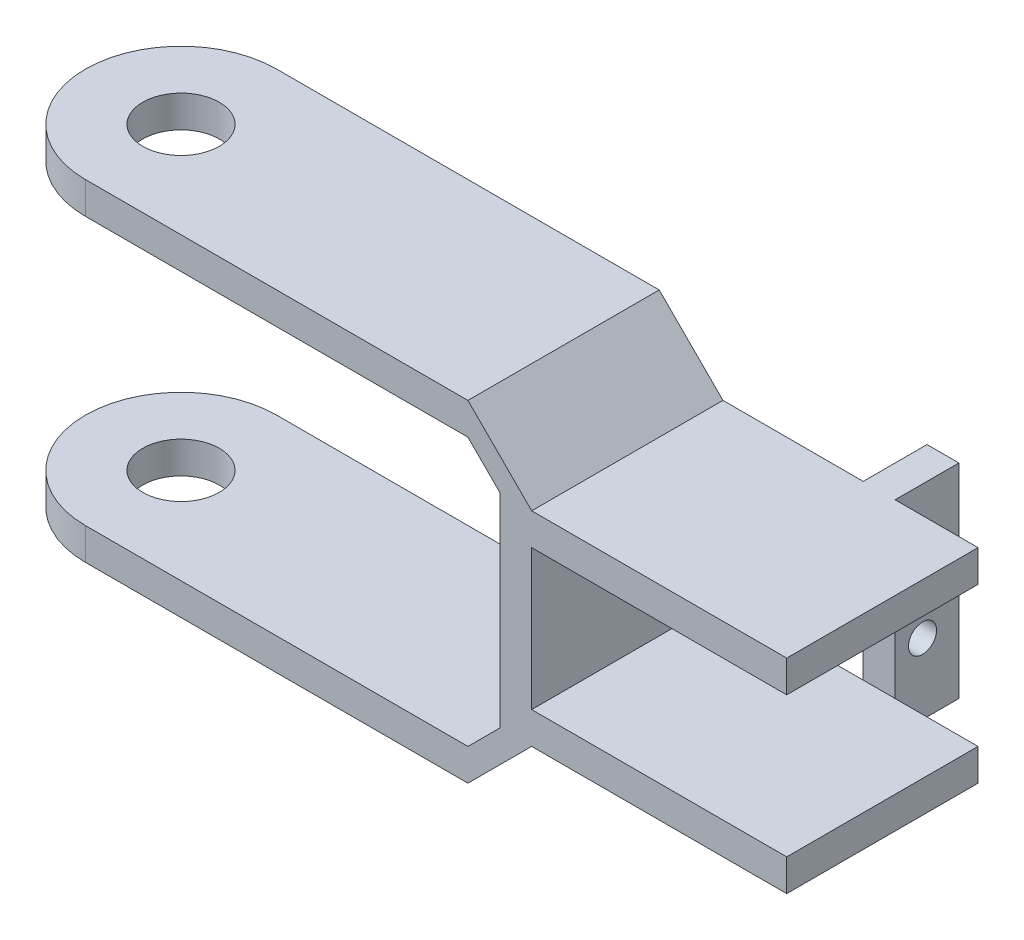
ISO-10303-21;
HEADER;
FILE_DESCRIPTION(('STEP AP214'),'2;1');
FILE_NAME('part.step','',(''),(''),'','','');
FILE_SCHEMA(('AUTOMOTIVE_DESIGN { 1 0 10303 214 1 1 1 1 }'));
ENDSEC;
DATA;
#1=APPLICATION_CONTEXT('core data for automotive mechanical design processes');
#2=APPLICATION_PROTOCOL_DEFINITION('international standard','automotive_design',2000,#1);
#3=PRODUCT_CONTEXT('',#1,'mechanical');
#4=PRODUCT('Part','Part','',(#3));
#5=PRODUCT_RELATED_PRODUCT_CATEGORY('part','',(#4));
#6=PRODUCT_DEFINITION_FORMATION('','',#4);
#7=PRODUCT_DEFINITION_CONTEXT('part definition',#1,'design');
#8=PRODUCT_DEFINITION('design','',#6,#7);
#9=PRODUCT_DEFINITION_SHAPE('','',#8);
#10=(LENGTH_UNIT() NAMED_UNIT(*) SI_UNIT(.MILLI.,.METRE.));
#11=(NAMED_UNIT(*) PLANE_ANGLE_UNIT() SI_UNIT($,.RADIAN.));
#12=(NAMED_UNIT(*) SI_UNIT($,.STERADIAN.) SOLID_ANGLE_UNIT());
#13=UNCERTAINTY_MEASURE_WITH_UNIT(LENGTH_MEASURE(1.E-05),#10,'distance_accuracy_value','');
#14=(GEOMETRIC_REPRESENTATION_CONTEXT(3) GLOBAL_UNCERTAINTY_ASSIGNED_CONTEXT((#13)) GLOBAL_UNIT_ASSIGNED_CONTEXT((#10,
#11,#12)) REPRESENTATION_CONTEXT('',''));
#15=CARTESIAN_POINT('',(0.,0.,0.));
#16=DIRECTION('',(0.,0.,1.));
#17=DIRECTION('',(1.,0.,0.));
#18=AXIS2_PLACEMENT_3D('',#15,#16,#17);
#19=CARTESIAN_POINT('',(0.,5.,-15.));
#20=DIRECTION('',(0.,0.,1.));
#21=DIRECTION('',(1.,0.,0.));
#22=AXIS2_PLACEMENT_3D('',#19,#20,#21);
#23=PLANE('',#22);
#24=DIRECTION('',(0.,-1.,0.));
#25=VECTOR('',#24,1.);
#26=CARTESIAN_POINT('',(97.,-10.,-15.));
#27=LINE('',#26,#25);
#28=CARTESIAN_POINT('',(97.,-5.,-15.));
#29=VERTEX_POINT('',#28);
#30=CARTESIAN_POINT('',(97.,-10.,-15.));
#31=VERTEX_POINT('',#30);
#32=EDGE_CURVE('E50',#29,#31,#27,.T.);
#33=ORIENTED_EDGE('',*,*,#32,.F.);
#34=DIRECTION('',(-1.,0.,0.));
#35=VECTOR('',#34,1.);
#36=CARTESIAN_POINT('',(110.,-5.,-15.));
#37=LINE('',#36,#35);
#38=CARTESIAN_POINT('',(110.,-5.,-15.));
#39=VERTEX_POINT('',#38);
#40=EDGE_CURVE('E340',#39,#29,#37,.T.);
#41=ORIENTED_EDGE('',*,*,#40,.F.);
#42=DIRECTION('',(0.,1.,0.));
#43=VECTOR('',#42,1.);
#44=CARTESIAN_POINT('',(110.,-10.,-15.));
#45=LINE('',#44,#43);
#46=CARTESIAN_POINT('',(110.,-10.,-15.));
#47=VERTEX_POINT('',#46);
#48=EDGE_CURVE('E336',#47,#39,#45,.T.);
#49=ORIENTED_EDGE('',*,*,#48,.F.);
#50=DIRECTION('',(1.,0.,0.));
#51=VECTOR('',#50,1.);
#52=CARTESIAN_POINT('',(70.,-10.,-15.));
#53=LINE('',#52,#51);
#54=EDGE_CURVE('E331',#31,#47,#53,.T.);
#55=ORIENTED_EDGE('',*,*,#54,.F.);
#56=EDGE_LOOP('',(#33,#41,#49,#55));
#57=FACE_BOUND('',#56,.T.);
#58=ADVANCED_FACE('F35',(#57),#23,.F.);
#59=CARTESIAN_POINT('',(97.,-32.,-15.));
#60=VERTEX_POINT('',#59);
#61=CARTESIAN_POINT('',(97.,-37.,-15.));
#62=VERTEX_POINT('',#61);
#63=EDGE_CURVE('E58',#60,#62,#27,.T.);
#64=ORIENTED_EDGE('',*,*,#63,.F.);
#65=DIRECTION('',(1.,0.,0.));
#66=VECTOR('',#65,1.);
#67=CARTESIAN_POINT('',(70.,-32.,-15.));
#68=LINE('',#67,#66);
#69=CARTESIAN_POINT('',(110.,-32.,-15.));
#70=VERTEX_POINT('',#69);
#71=EDGE_CURVE('E266',#60,#70,#68,.T.);
#72=ORIENTED_EDGE('',*,*,#71,.T.);
#73=DIRECTION('',(0.,-1.,0.));
#74=VECTOR('',#73,1.);
#75=CARTESIAN_POINT('',(110.,-32.,-15.));
#76=LINE('',#75,#74);
#77=CARTESIAN_POINT('',(110.,-37.,-15.));
#78=VERTEX_POINT('',#77);
#79=EDGE_CURVE('E286',#70,#78,#76,.T.);
#80=ORIENTED_EDGE('',*,*,#79,.T.);
#81=DIRECTION('',(-1.,0.,0.));
#82=VECTOR('',#81,1.);
#83=CARTESIAN_POINT('',(110.,-37.,-15.));
#84=LINE('',#83,#82);
#85=EDGE_CURVE('E290',#78,#62,#84,.T.);
#86=ORIENTED_EDGE('',*,*,#85,.T.);
#87=EDGE_LOOP('',(#64,#72,#80,#86));
#88=FACE_BOUND('',#87,.T.);
#89=ADVANCED_FACE('F488',(#88),#23,.F.);
#90=DIRECTION('',(0.,1.,0.));
#91=VECTOR('',#90,1.);
#92=CARTESIAN_POINT('',(92.,-37.,-15.));
#93=LINE('',#92,#91);
#94=CARTESIAN_POINT('',(92.,-37.,-15.));
#95=VERTEX_POINT('',#94);
#96=CARTESIAN_POINT('',(92.,-32.,-15.));
#97=VERTEX_POINT('',#96);
#98=EDGE_CURVE('E205',#95,#97,#93,.T.);
#99=ORIENTED_EDGE('',*,*,#98,.F.);
#100=CARTESIAN_POINT('',(70.,-37.,-15.));
#101=VERTEX_POINT('',#100);
#102=EDGE_CURVE('E289',#95,#101,#84,.T.);
#103=ORIENTED_EDGE('',*,*,#102,.T.);
#104=DIRECTION('',(-0.707106781186547,-0.707106781186548,0.));
#105=VECTOR('',#104,1.);
#106=CARTESIAN_POINT('',(70.,-37.,-15.));
#107=LINE('',#106,#105);
#108=CARTESIAN_POINT('',(60.,-47.,-15.));
#109=VERTEX_POINT('',#108);
#110=EDGE_CURVE('E292',#101,#109,#107,.T.);
#111=ORIENTED_EDGE('',*,*,#110,.T.);
#112=DIRECTION('',(1.,0.,0.));
#113=VECTOR('',#112,1.);
#114=CARTESIAN_POINT('',(0.,-47.,-15.));
#115=LINE('',#114,#113);
#116=CARTESIAN_POINT('',(0.,-47.,-15.));
#117=VERTEX_POINT('',#116);
#118=EDGE_CURVE('E250',#117,#109,#115,.T.);
#119=ORIENTED_EDGE('',*,*,#118,.F.);
#120=DIRECTION('',(0.,1.,0.));
#121=VECTOR('',#120,1.);
#122=CARTESIAN_POINT('',(0.,-47.,-15.));
#123=LINE('',#122,#121);
#124=CARTESIAN_POINT('',(0.,-42.,-15.));
#125=VERTEX_POINT('',#124);
#126=EDGE_CURVE('E263',#117,#125,#123,.T.);
#127=ORIENTED_EDGE('',*,*,#126,.T.);
#128=DIRECTION('',(1.,0.,0.));
#129=VECTOR('',#128,1.);
#130=CARTESIAN_POINT('',(0.,-42.,-15.));
#131=LINE('',#130,#129);
#132=CARTESIAN_POINT('',(60.,-42.,-15.));
#133=VERTEX_POINT('',#132);
#134=EDGE_CURVE('E258',#125,#133,#131,.T.);
#135=ORIENTED_EDGE('',*,*,#134,.T.);
#136=DIRECTION('',(0.707106781186546,0.707106781186548,0.));
#137=VECTOR('',#136,1.);
#138=CARTESIAN_POINT('',(70.,-32.,-15.));
#139=LINE('',#138,#137);
#140=CARTESIAN_POINT('',(65.,-37.,-15.));
#141=VERTEX_POINT('',#140);
#142=EDGE_CURVE('E271',#133,#141,#139,.T.);
#143=ORIENTED_EDGE('',*,*,#142,.T.);
#144=DIRECTION('',(0.,-1.,0.));
#145=VECTOR('',#144,1.);
#146=CARTESIAN_POINT('',(65.,-21.,-15.));
#147=LINE('',#146,#145);
#148=CARTESIAN_POINT('',(65.,-5.,-15.));
#149=VERTEX_POINT('',#148);
#150=EDGE_CURVE('E315',#149,#141,#147,.T.);
#151=ORIENTED_EDGE('',*,*,#150,.F.);
#152=DIRECTION('',(0.707106781186547,-0.707106781186548,0.));
#153=VECTOR('',#152,1.);
#154=CARTESIAN_POINT('',(60.,0.,-15.));
#155=LINE('',#154,#153);
#156=CARTESIAN_POINT('',(60.,0.,-15.));
#157=VERTEX_POINT('',#156);
#158=EDGE_CURVE('E328',#157,#149,#155,.T.);
#159=ORIENTED_EDGE('',*,*,#158,.F.);
#160=DIRECTION('',(-1.,0.,0.));
#161=VECTOR('',#160,1.);
#162=CARTESIAN_POINT('',(0.,0.,-15.));
#163=LINE('',#162,#161);
#164=CARTESIAN_POINT('',(0.,0.,-15.));
#165=VERTEX_POINT('',#164);
#166=EDGE_CURVE('E379',#157,#165,#163,.T.);
#167=ORIENTED_EDGE('',*,*,#166,.T.);
#168=DIRECTION('',(0.,-1.,0.));
#169=VECTOR('',#168,1.);
#170=CARTESIAN_POINT('',(0.,5.,-15.));
#171=LINE('',#170,#169);
#172=CARTESIAN_POINT('',(0.,5.,-15.));
#173=VERTEX_POINT('',#172);
#174=EDGE_CURVE('E43',#173,#165,#171,.T.);
#175=ORIENTED_EDGE('',*,*,#174,.F.);
#176=DIRECTION('',(-1.,0.,0.));
#177=VECTOR('',#176,1.);
#178=CARTESIAN_POINT('',(0.,5.,-15.));
#179=LINE('',#178,#177);
#180=CARTESIAN_POINT('',(60.,5.,-15.));
#181=VERTEX_POINT('',#180);
#182=EDGE_CURVE('E383',#181,#173,#179,.T.);
#183=ORIENTED_EDGE('',*,*,#182,.F.);
#184=DIRECTION('',(-0.707106781186547,0.707106781186548,0.));
#185=VECTOR('',#184,1.);
#186=CARTESIAN_POINT('',(70.,-5.,-15.));
#187=LINE('',#186,#185);
#188=CARTESIAN_POINT('',(70.,-5.,-15.));
#189=VERTEX_POINT('',#188);
#190=EDGE_CURVE('E343',#189,#181,#187,.T.);
#191=ORIENTED_EDGE('',*,*,#190,.F.);
#192=CARTESIAN_POINT('',(92.,-5.,-15.));
#193=VERTEX_POINT('',#192);
#194=EDGE_CURVE('E339',#193,#189,#37,.T.);
#195=ORIENTED_EDGE('',*,*,#194,.F.);
#196=CARTESIAN_POINT('',(92.,-10.,-15.));
#197=VERTEX_POINT('',#196);
#198=EDGE_CURVE('E226',#197,#193,#93,.T.);
#199=ORIENTED_EDGE('',*,*,#198,.F.);
#200=CARTESIAN_POINT('',(70.,-10.,-15.));
#201=VERTEX_POINT('',#200);
#202=EDGE_CURVE('E333',#201,#197,#53,.T.);
#203=ORIENTED_EDGE('',*,*,#202,.F.);
#204=DIRECTION('',(0.,1.,0.));
#205=VECTOR('',#204,1.);
#206=CARTESIAN_POINT('',(70.,-10.,-15.));
#207=LINE('',#206,#205);
#208=CARTESIAN_POINT('',(70.,-32.,-15.));
#209=VERTEX_POINT('',#208);
#210=EDGE_CURVE('E318',#209,#201,#207,.T.);
#211=ORIENTED_EDGE('',*,*,#210,.F.);
#212=EDGE_CURVE('E283',#209,#97,#68,.T.);
#213=ORIENTED_EDGE('',*,*,#212,.T.);
#214=EDGE_LOOP('',(#99,#103,#111,#119,#127,#135,#143,#151,#159,#167,#175,#183,#191,#195,#199,
#203,#211,#213));
#215=FACE_BOUND('',#214,.T.);
#216=ADVANCED_FACE('F414',(#215),#23,.F.);
#217=CARTESIAN_POINT('',(0.,5.,0.));
#218=DIRECTION('',(0.,1.,0.));
#219=DIRECTION('',(0.,0.,1.));
#220=AXIS2_PLACEMENT_3D('',#217,#218,#219);
#221=PLANE('',#220);
#222=CARTESIAN_POINT('',(0.,5.,0.));
#223=DIRECTION('',(0.,1.,0.));
#224=DIRECTION('',(0.,0.,1.));
#225=AXIS2_PLACEMENT_3D('',#222,#223,#224);
#226=CIRCLE('',#225,15.);
#227=CARTESIAN_POINT('',(0.,5.,15.));
#228=VERTEX_POINT('',#227);
#229=EDGE_CURVE('E375',#173,#228,#226,.T.);
#230=ORIENTED_EDGE('',*,*,#229,.T.);
#231=DIRECTION('',(1.,0.,0.));
#232=VECTOR('',#231,1.);
#233=CARTESIAN_POINT('',(0.,5.,15.));
#234=LINE('',#233,#232);
#235=CARTESIAN_POINT('',(60.,5.,15.));
#236=VERTEX_POINT('',#235);
#237=EDGE_CURVE('E378',#228,#236,#234,.T.);
#238=ORIENTED_EDGE('',*,*,#237,.T.);
#239=DIRECTION('',(0.,0.,-1.));
#240=VECTOR('',#239,1.);
#241=CARTESIAN_POINT('',(60.,5.,15.));
#242=LINE('',#241,#240);
#243=EDGE_CURVE('E381',#236,#181,#242,.T.);
#244=ORIENTED_EDGE('',*,*,#243,.T.);
#245=ORIENTED_EDGE('',*,*,#182,.T.);
#246=EDGE_LOOP('',(#230,#238,#244,#245));
#247=FACE_BOUND('',#246,.T.);
#248=CARTESIAN_POINT('',(0.,5.,0.));
#249=DIRECTION('',(0.,1.,0.));
#250=DIRECTION('',(0.,0.,1.));
#251=AXIS2_PLACEMENT_3D('',#248,#249,#250);
#252=CIRCLE('',#251,6.);
#253=CARTESIAN_POINT('',(0.,5.,6.));
#254=VERTEX_POINT('',#253);
#255=EDGE_CURVE('E369',#254,#254,#252,.T.);
#256=ORIENTED_EDGE('',*,*,#255,.F.);
#257=EDGE_LOOP('',(#256));
#258=FACE_BOUND('',#257,.T.);
#259=ADVANCED_FACE('F410',(#247,#258),#221,.T.);
#260=CARTESIAN_POINT('',(0.,0.,0.));
#261=DIRECTION('',(0.,1.,0.));
#262=DIRECTION('',(0.,0.,1.));
#263=AXIS2_PLACEMENT_3D('',#260,#261,#262);
#264=PLANE('',#263);
#265=CARTESIAN_POINT('',(0.,0.,0.));
#266=DIRECTION('',(0.,1.,0.));
#267=DIRECTION('',(0.,0.,1.));
#268=AXIS2_PLACEMENT_3D('',#265,#266,#267);
#269=CIRCLE('',#268,15.);
#270=CARTESIAN_POINT('',(0.,0.,15.));
#271=VERTEX_POINT('',#270);
#272=EDGE_CURVE('E372',#165,#271,#269,.T.);
#273=ORIENTED_EDGE('',*,*,#272,.F.);
#274=ORIENTED_EDGE('',*,*,#166,.F.);
#275=DIRECTION('',(0.,0.,-1.));
#276=VECTOR('',#275,1.);
#277=CARTESIAN_POINT('',(60.,0.,15.));
#278=LINE('',#277,#276);
#279=CARTESIAN_POINT('',(60.,0.,15.));
#280=VERTEX_POINT('',#279);
#281=EDGE_CURVE('E390',#280,#157,#278,.T.);
#282=ORIENTED_EDGE('',*,*,#281,.F.);
#283=DIRECTION('',(1.,0.,0.));
#284=VECTOR('',#283,1.);
#285=CARTESIAN_POINT('',(0.,0.,15.));
#286=LINE('',#285,#284);
#287=EDGE_CURVE('E387',#271,#280,#286,.T.);
#288=ORIENTED_EDGE('',*,*,#287,.F.);
#289=EDGE_LOOP('',(#273,#274,#282,#288));
#290=FACE_BOUND('',#289,.T.);
#291=CARTESIAN_POINT('',(0.,0.,0.));
#292=DIRECTION('',(0.,1.,0.));
#293=DIRECTION('',(0.,0.,1.));
#294=AXIS2_PLACEMENT_3D('',#291,#292,#293);
#295=CIRCLE('',#294,6.);
#296=CARTESIAN_POINT('',(0.,0.,6.));
#297=VERTEX_POINT('',#296);
#298=EDGE_CURVE('E362',#297,#297,#295,.T.);
#299=ORIENTED_EDGE('',*,*,#298,.T.);
#300=EDGE_LOOP('',(#299));
#301=FACE_BOUND('',#300,.T.);
#302=ADVANCED_FACE('F402',(#290,#301),#264,.F.);
#303=CARTESIAN_POINT('',(0.,5.,0.));
#304=DIRECTION('',(0.,-1.,0.));
#305=DIRECTION('',(0.,0.,-1.));
#306=AXIS2_PLACEMENT_3D('',#303,#304,#305);
#307=CYLINDRICAL_SURFACE('',#306,15.);
#308=ORIENTED_EDGE('',*,*,#272,.T.);
#309=DIRECTION('',(0.,-1.,0.));
#310=VECTOR('',#309,1.);
#311=CARTESIAN_POINT('',(0.,5.,15.));
#312=LINE('',#311,#310);
#313=EDGE_CURVE('E11',#228,#271,#312,.T.);
#314=ORIENTED_EDGE('',*,*,#313,.F.);
#315=ORIENTED_EDGE('',*,*,#229,.F.);
#316=ORIENTED_EDGE('',*,*,#174,.T.);
#317=EDGE_LOOP('',(#308,#314,#315,#316));
#318=FACE_BOUND('',#317,.T.);
#319=ADVANCED_FACE('F37',(#318),#307,.T.);
#320=CARTESIAN_POINT('',(0.,5.,15.));
#321=DIRECTION('',(0.,0.,-1.));
#322=DIRECTION('',(-1.,0.,0.));
#323=AXIS2_PLACEMENT_3D('',#320,#321,#322);
#324=PLANE('',#323);
#325=ORIENTED_EDGE('',*,*,#287,.T.);
#326=DIRECTION('',(0.707106781186547,-0.707106781186548,0.));
#327=VECTOR('',#326,1.);
#328=CARTESIAN_POINT('',(60.,0.,15.));
#329=LINE('',#328,#327);
#330=CARTESIAN_POINT('',(65.,-5.,15.));
#331=VERTEX_POINT('',#330);
#332=EDGE_CURVE('E327',#280,#331,#329,.T.);
#333=ORIENTED_EDGE('',*,*,#332,.T.);
#334=DIRECTION('',(0.,-1.,0.));
#335=VECTOR('',#334,1.);
#336=CARTESIAN_POINT('',(65.,-21.,15.));
#337=LINE('',#336,#335);
#338=CARTESIAN_POINT('',(65.,-37.,15.));
#339=VERTEX_POINT('',#338);
#340=EDGE_CURVE('E313',#331,#339,#337,.T.);
#341=ORIENTED_EDGE('',*,*,#340,.T.);
#342=DIRECTION('',(0.707106781186548,0.707106781186547,0.));
#343=VECTOR('',#342,1.);
#344=CARTESIAN_POINT('',(60.,-42.,15.));
#345=LINE('',#344,#343);
#346=CARTESIAN_POINT('',(60.,-42.,15.));
#347=VERTEX_POINT('',#346);
#348=EDGE_CURVE('E280',#347,#339,#345,.T.);
#349=ORIENTED_EDGE('',*,*,#348,.F.);
#350=DIRECTION('',(-1.,0.,0.));
#351=VECTOR('',#350,1.);
#352=CARTESIAN_POINT('',(60.,-42.,15.));
#353=LINE('',#352,#351);
#354=CARTESIAN_POINT('',(0.,-42.,15.));
#355=VERTEX_POINT('',#354);
#356=EDGE_CURVE('E251',#347,#355,#353,.T.);
#357=ORIENTED_EDGE('',*,*,#356,.T.);
#358=DIRECTION('',(0.,1.,0.));
#359=VECTOR('',#358,1.);
#360=CARTESIAN_POINT('',(0.,-47.,15.));
#361=LINE('',#360,#359);
#362=CARTESIAN_POINT('',(0.,-47.,15.));
#363=VERTEX_POINT('',#362);
#364=EDGE_CURVE('E255',#363,#355,#361,.T.);
#365=ORIENTED_EDGE('',*,*,#364,.F.);
#366=DIRECTION('',(-1.,0.,0.));
#367=VECTOR('',#366,1.);
#368=CARTESIAN_POINT('',(60.,-47.,15.));
#369=LINE('',#368,#367);
#370=CARTESIAN_POINT('',(60.,-47.,15.));
#371=VERTEX_POINT('',#370);
#372=EDGE_CURVE('E253',#371,#363,#369,.T.);
#373=ORIENTED_EDGE('',*,*,#372,.F.);
#374=DIRECTION('',(-0.707106781186547,-0.707106781186548,0.));
#375=VECTOR('',#374,1.);
#376=CARTESIAN_POINT('',(70.,-37.,15.));
#377=LINE('',#376,#375);
#378=CARTESIAN_POINT('',(70.,-37.,15.));
#379=VERTEX_POINT('',#378);
#380=EDGE_CURVE('E277',#379,#371,#377,.T.);
#381=ORIENTED_EDGE('',*,*,#380,.F.);
#382=DIRECTION('',(-1.,0.,0.));
#383=VECTOR('',#382,1.);
#384=CARTESIAN_POINT('',(110.,-37.,15.));
#385=LINE('',#384,#383);
#386=CARTESIAN_POINT('',(110.,-37.,15.));
#387=VERTEX_POINT('',#386);
#388=EDGE_CURVE('E274',#387,#379,#385,.T.);
#389=ORIENTED_EDGE('',*,*,#388,.F.);
#390=DIRECTION('',(0.,-1.,0.));
#391=VECTOR('',#390,1.);
#392=CARTESIAN_POINT('',(110.,-32.,15.));
#393=LINE('',#392,#391);
#394=CARTESIAN_POINT('',(110.,-32.,15.));
#395=VERTEX_POINT('',#394);
#396=EDGE_CURVE('E270',#395,#387,#393,.T.);
#397=ORIENTED_EDGE('',*,*,#396,.F.);
#398=DIRECTION('',(1.,0.,0.));
#399=VECTOR('',#398,1.);
#400=CARTESIAN_POINT('',(70.,-32.,15.));
#401=LINE('',#400,#399);
#402=CARTESIAN_POINT('',(70.,-32.,15.));
#403=VERTEX_POINT('',#402);
#404=EDGE_CURVE('E267',#403,#395,#401,.T.);
#405=ORIENTED_EDGE('',*,*,#404,.F.);
#406=DIRECTION('',(0.,1.,0.));
#407=VECTOR('',#406,1.);
#408=CARTESIAN_POINT('',(70.,-10.,15.));
#409=LINE('',#408,#407);
#410=CARTESIAN_POINT('',(70.,-10.,15.));
#411=VERTEX_POINT('',#410);
#412=EDGE_CURVE('E319',#403,#411,#409,.T.);
#413=ORIENTED_EDGE('',*,*,#412,.T.);
#414=DIRECTION('',(1.,0.,0.));
#415=VECTOR('',#414,1.);
#416=CARTESIAN_POINT('',(70.,-10.,15.));
#417=LINE('',#416,#415);
#418=CARTESIAN_POINT('',(110.,-10.,15.));
#419=VERTEX_POINT('',#418);
#420=EDGE_CURVE('E349',#411,#419,#417,.T.);
#421=ORIENTED_EDGE('',*,*,#420,.T.);
#422=DIRECTION('',(0.,1.,0.));
#423=VECTOR('',#422,1.);
#424=CARTESIAN_POINT('',(110.,-10.,15.));
#425=LINE('',#424,#423);
#426=CARTESIAN_POINT('',(110.,-5.,15.));
#427=VERTEX_POINT('',#426);
#428=EDGE_CURVE('E352',#419,#427,#425,.T.);
#429=ORIENTED_EDGE('',*,*,#428,.T.);
#430=DIRECTION('',(-1.,0.,0.));
#431=VECTOR('',#430,1.);
#432=CARTESIAN_POINT('',(110.,-5.,15.));
#433=LINE('',#432,#431);
#434=CARTESIAN_POINT('',(70.,-5.,15.));
#435=VERTEX_POINT('',#434);
#436=EDGE_CURVE('E355',#427,#435,#433,.T.);
#437=ORIENTED_EDGE('',*,*,#436,.T.);
#438=DIRECTION('',(-0.707106781186547,0.707106781186548,0.));
#439=VECTOR('',#438,1.);
#440=CARTESIAN_POINT('',(70.,-5.,15.));
#441=LINE('',#440,#439);
#442=EDGE_CURVE('E332',#435,#236,#441,.T.);
#443=ORIENTED_EDGE('',*,*,#442,.T.);
#444=ORIENTED_EDGE('',*,*,#237,.F.);
#445=ORIENTED_EDGE('',*,*,#313,.T.);
#446=EDGE_LOOP('',(#325,#333,#341,#349,#357,#365,#373,#381,#389,#397,#405,#413,#421,#429,#437,
#443,#444,#445));
#447=FACE_BOUND('',#446,.T.);
#448=ADVANCED_FACE('F406',(#447),#324,.F.);
#449=CARTESIAN_POINT('',(0.,5.,0.));
#450=DIRECTION('',(0.,-1.,0.));
#451=DIRECTION('',(0.,0.,-1.));
#452=AXIS2_PLACEMENT_3D('',#449,#450,#451);
#453=CYLINDRICAL_SURFACE('',#452,6.);
#454=ORIENTED_EDGE('',*,*,#255,.T.);
#455=EDGE_LOOP('',(#454));
#456=FACE_BOUND('',#455,.T.);
#457=ORIENTED_EDGE('',*,*,#298,.F.);
#458=EDGE_LOOP('',(#457));
#459=FACE_BOUND('',#458,.T.);
#460=ADVANCED_FACE('F503',(#456,#459),#453,.F.);
#461=CARTESIAN_POINT('',(70.,-5.,-15.));
#462=DIRECTION('',(0.707106781186548,0.707106781186547,0.));
#463=DIRECTION('',(-0.707106781186547,0.707106781186548,0.));
#464=AXIS2_PLACEMENT_3D('',#461,#462,#463);
#465=PLANE('',#464);
#466=ORIENTED_EDGE('',*,*,#442,.F.);
#467=DIRECTION('',(0.,0.,1.));
#468=VECTOR('',#467,1.);
#469=CARTESIAN_POINT('',(70.,-5.,-15.));
#470=LINE('',#469,#468);
#471=EDGE_CURVE('E360',#189,#435,#470,.T.);
#472=ORIENTED_EDGE('',*,*,#471,.F.);
#473=ORIENTED_EDGE('',*,*,#190,.T.);
#474=ORIENTED_EDGE('',*,*,#243,.F.);
#475=EDGE_LOOP('',(#466,#472,#473,#474));
#476=FACE_BOUND('',#475,.T.);
#477=ADVANCED_FACE('F418',(#476),#465,.T.);
#478=CARTESIAN_POINT('',(110.,-5.,-15.));
#479=DIRECTION('',(0.,1.,0.));
#480=DIRECTION('',(0.,0.,1.));
#481=AXIS2_PLACEMENT_3D('',#478,#479,#480);
#482=PLANE('',#481);
#483=ORIENTED_EDGE('',*,*,#436,.F.);
#484=DIRECTION('',(0.,0.,1.));
#485=VECTOR('',#484,1.);
#486=CARTESIAN_POINT('',(110.,-5.,-15.));
#487=LINE('',#486,#485);
#488=EDGE_CURVE('E363',#39,#427,#487,.T.);
#489=ORIENTED_EDGE('',*,*,#488,.F.);
#490=ORIENTED_EDGE('',*,*,#40,.T.);
#491=DIRECTION('',(0.,0.,1.));
#492=VECTOR('',#491,1.);
#493=CARTESIAN_POINT('',(97.,-5.,-25.));
#494=LINE('',#493,#492);
#495=CARTESIAN_POINT('',(97.,-5.,-25.));
#496=VERTEX_POINT('',#495);
#497=EDGE_CURVE('E224',#496,#29,#494,.T.);
#498=ORIENTED_EDGE('',*,*,#497,.F.);
#499=DIRECTION('',(1.,0.,0.));
#500=VECTOR('',#499,1.);
#501=CARTESIAN_POINT('',(92.,-5.,-25.));
#502=LINE('',#501,#500);
#503=CARTESIAN_POINT('',(92.,-5.,-25.));
#504=VERTEX_POINT('',#503);
#505=EDGE_CURVE('E203',#504,#496,#502,.T.);
#506=ORIENTED_EDGE('',*,*,#505,.F.);
#507=DIRECTION('',(0.,0.,1.));
#508=VECTOR('',#507,1.);
#509=CARTESIAN_POINT('',(92.,-5.,-25.));
#510=LINE('',#509,#508);
#511=EDGE_CURVE('E232',#504,#193,#510,.T.);
#512=ORIENTED_EDGE('',*,*,#511,.T.);
#513=ORIENTED_EDGE('',*,*,#194,.T.);
#514=ORIENTED_EDGE('',*,*,#471,.T.);
#515=EDGE_LOOP('',(#483,#489,#490,#498,#506,#512,#513,#514));
#516=FACE_BOUND('',#515,.T.);
#517=ADVANCED_FACE('F421',(#516),#482,.T.);
#518=CARTESIAN_POINT('',(110.,-10.,-15.));
#519=DIRECTION('',(1.,0.,0.));
#520=DIRECTION('',(0.,0.,-1.));
#521=AXIS2_PLACEMENT_3D('',#518,#519,#520);
#522=PLANE('',#521);
#523=ORIENTED_EDGE('',*,*,#428,.F.);
#524=DIRECTION('',(0.,0.,1.));
#525=VECTOR('',#524,1.);
#526=CARTESIAN_POINT('',(110.,-10.,-15.));
#527=LINE('',#526,#525);
#528=EDGE_CURVE('E365',#47,#419,#527,.T.);
#529=ORIENTED_EDGE('',*,*,#528,.F.);
#530=ORIENTED_EDGE('',*,*,#48,.T.);
#531=ORIENTED_EDGE('',*,*,#488,.T.);
#532=EDGE_LOOP('',(#523,#529,#530,#531));
#533=FACE_BOUND('',#532,.T.);
#534=ADVANCED_FACE('F426',(#533),#522,.T.);
#535=CARTESIAN_POINT('',(70.,-10.,-15.));
#536=DIRECTION('',(0.,-1.,0.));
#537=DIRECTION('',(1.,0.,0.));
#538=AXIS2_PLACEMENT_3D('',#535,#536,#537);
#539=PLANE('',#538);
#540=ORIENTED_EDGE('',*,*,#420,.F.);
#541=DIRECTION('',(0.,0.,1.));
#542=VECTOR('',#541,1.);
#543=CARTESIAN_POINT('',(70.,-10.,-15.));
#544=LINE('',#543,#542);
#545=EDGE_CURVE('E346',#201,#411,#544,.T.);
#546=ORIENTED_EDGE('',*,*,#545,.F.);
#547=ORIENTED_EDGE('',*,*,#202,.T.);
#548=DIRECTION('',(1.,0.,0.));
#549=VECTOR('',#548,1.);
#550=CARTESIAN_POINT('',(70.,-10.,-15.));
#551=LINE('',#550,#549);
#552=EDGE_CURVE('E237',#197,#31,#551,.T.);
#553=ORIENTED_EDGE('',*,*,#552,.T.);
#554=ORIENTED_EDGE('',*,*,#54,.T.);
#555=ORIENTED_EDGE('',*,*,#528,.T.);
#556=EDGE_LOOP('',(#540,#546,#547,#553,#554,#555));
#557=FACE_BOUND('',#556,.T.);
#558=ADVANCED_FACE('F432',(#557),#539,.T.);
#559=CARTESIAN_POINT('',(60.,0.,-15.));
#560=DIRECTION('',(-0.707106781186548,-0.707106781186547,0.));
#561=DIRECTION('',(0.707106781186547,-0.707106781186548,0.));
#562=AXIS2_PLACEMENT_3D('',#559,#560,#561);
#563=PLANE('',#562);
#564=DIRECTION('',(0.,0.,1.));
#565=VECTOR('',#564,1.);
#566=CARTESIAN_POINT('',(65.,-5.,-15.));
#567=LINE('',#566,#565);
#568=EDGE_CURVE('E321',#149,#331,#567,.T.);
#569=ORIENTED_EDGE('',*,*,#568,.T.);
#570=ORIENTED_EDGE('',*,*,#332,.F.);
#571=ORIENTED_EDGE('',*,*,#281,.T.);
#572=ORIENTED_EDGE('',*,*,#158,.T.);
#573=EDGE_LOOP('',(#569,#570,#571,#572));
#574=FACE_BOUND('',#573,.T.);
#575=ADVANCED_FACE('F507',(#574),#563,.T.);
#576=CARTESIAN_POINT('',(70.,-10.,-15.));
#577=DIRECTION('',(1.,0.,0.));
#578=DIRECTION('',(0.,0.,-1.));
#579=AXIS2_PLACEMENT_3D('',#576,#577,#578);
#580=PLANE('',#579);
#581=ORIENTED_EDGE('',*,*,#412,.F.);
#582=DIRECTION('',(0.,0.,1.));
#583=VECTOR('',#582,1.);
#584=CARTESIAN_POINT('',(70.,-32.,-15.));
#585=LINE('',#584,#583);
#586=EDGE_CURVE('E299',#209,#403,#585,.T.);
#587=ORIENTED_EDGE('',*,*,#586,.F.);
#588=ORIENTED_EDGE('',*,*,#210,.T.);
#589=ORIENTED_EDGE('',*,*,#545,.T.);
#590=EDGE_LOOP('',(#581,#587,#588,#589));
#591=FACE_BOUND('',#590,.T.);
#592=ADVANCED_FACE('F448',(#591),#580,.T.);
#593=CARTESIAN_POINT('',(65.,-21.,-15.));
#594=DIRECTION('',(-1.,0.,0.));
#595=DIRECTION('',(0.,0.,1.));
#596=AXIS2_PLACEMENT_3D('',#593,#594,#595);
#597=PLANE('',#596);
#598=ORIENTED_EDGE('',*,*,#340,.F.);
#599=ORIENTED_EDGE('',*,*,#568,.F.);
#600=ORIENTED_EDGE('',*,*,#150,.T.);
#601=DIRECTION('',(0.,0.,1.));
#602=VECTOR('',#601,1.);
#603=CARTESIAN_POINT('',(65.,-37.,-15.));
#604=LINE('',#603,#602);
#605=EDGE_CURVE('E310',#141,#339,#604,.T.);
#606=ORIENTED_EDGE('',*,*,#605,.T.);
#607=EDGE_LOOP('',(#598,#599,#600,#606));
#608=FACE_BOUND('',#607,.T.);
#609=ADVANCED_FACE('F519',(#608),#597,.T.);
#610=CARTESIAN_POINT('',(70.,-32.,15.));
#611=DIRECTION('',(0.,1.,0.));
#612=DIRECTION('',(0.,0.,1.));
#613=AXIS2_PLACEMENT_3D('',#610,#611,#612);
#614=PLANE('',#613);
#615=ORIENTED_EDGE('',*,*,#212,.F.);
#616=ORIENTED_EDGE('',*,*,#586,.T.);
#617=ORIENTED_EDGE('',*,*,#404,.T.);
#618=DIRECTION('',(0.,0.,-1.));
#619=VECTOR('',#618,1.);
#620=CARTESIAN_POINT('',(110.,-32.,15.));
#621=LINE('',#620,#619);
#622=EDGE_CURVE('E282',#395,#70,#621,.T.);
#623=ORIENTED_EDGE('',*,*,#622,.T.);
#624=ORIENTED_EDGE('',*,*,#71,.F.);
#625=DIRECTION('',(-1.,0.,0.));
#626=VECTOR('',#625,1.);
#627=CARTESIAN_POINT('',(70.,-32.,-15.));
#628=LINE('',#627,#626);
#629=EDGE_CURVE('E212',#60,#97,#628,.T.);
#630=ORIENTED_EDGE('',*,*,#629,.T.);
#631=EDGE_LOOP('',(#615,#616,#617,#623,#624,#630));
#632=FACE_BOUND('',#631,.T.);
#633=ADVANCED_FACE('F451',(#632),#614,.T.);
#634=CARTESIAN_POINT('',(70.,-32.,15.));
#635=DIRECTION('',(-0.707106781186549,0.707106781186546,0.));
#636=DIRECTION('',(-0.707106781186546,-0.707106781186549,0.));
#637=AXIS2_PLACEMENT_3D('',#634,#635,#636);
#638=PLANE('',#637);
#639=ORIENTED_EDGE('',*,*,#348,.T.);
#640=ORIENTED_EDGE('',*,*,#605,.F.);
#641=ORIENTED_EDGE('',*,*,#142,.F.);
#642=DIRECTION('',(0.,0.,-1.));
#643=VECTOR('',#642,1.);
#644=CARTESIAN_POINT('',(60.,-42.,15.));
#645=LINE('',#644,#643);
#646=EDGE_CURVE('E296',#347,#133,#645,.T.);
#647=ORIENTED_EDGE('',*,*,#646,.F.);
#648=EDGE_LOOP('',(#639,#640,#641,#647));
#649=FACE_BOUND('',#648,.T.);
#650=ADVANCED_FACE('F527',(#649),#638,.T.);
#651=CARTESIAN_POINT('',(70.,-37.,15.));
#652=DIRECTION('',(0.707106781186548,-0.707106781186547,0.));
#653=DIRECTION('',(0.707106781186547,0.707106781186548,0.));
#654=AXIS2_PLACEMENT_3D('',#651,#652,#653);
#655=PLANE('',#654);
#656=ORIENTED_EDGE('',*,*,#110,.F.);
#657=DIRECTION('',(0.,0.,-1.));
#658=VECTOR('',#657,1.);
#659=CARTESIAN_POINT('',(70.,-37.,15.));
#660=LINE('',#659,#658);
#661=EDGE_CURVE('E303',#379,#101,#660,.T.);
#662=ORIENTED_EDGE('',*,*,#661,.F.);
#663=ORIENTED_EDGE('',*,*,#380,.T.);
#664=DIRECTION('',(0.,0.,-1.));
#665=VECTOR('',#664,1.);
#666=CARTESIAN_POINT('',(60.,-47.,15.));
#667=LINE('',#666,#665);
#668=EDGE_CURVE('E300',#371,#109,#667,.T.);
#669=ORIENTED_EDGE('',*,*,#668,.T.);
#670=EDGE_LOOP('',(#656,#662,#663,#669));
#671=FACE_BOUND('',#670,.T.);
#672=ADVANCED_FACE('F533',(#671),#655,.T.);
#673=CARTESIAN_POINT('',(110.,-37.,15.));
#674=DIRECTION('',(0.,-1.,0.));
#675=DIRECTION('',(0.,0.,-1.));
#676=AXIS2_PLACEMENT_3D('',#673,#674,#675);
#677=PLANE('',#676);
#678=ORIENTED_EDGE('',*,*,#85,.F.);
#679=DIRECTION('',(0.,0.,-1.));
#680=VECTOR('',#679,1.);
#681=CARTESIAN_POINT('',(110.,-37.,15.));
#682=LINE('',#681,#680);
#683=EDGE_CURVE('E306',#387,#78,#682,.T.);
#684=ORIENTED_EDGE('',*,*,#683,.F.);
#685=ORIENTED_EDGE('',*,*,#388,.T.);
#686=ORIENTED_EDGE('',*,*,#661,.T.);
#687=ORIENTED_EDGE('',*,*,#102,.F.);
#688=DIRECTION('',(0.,0.,1.));
#689=VECTOR('',#688,1.);
#690=CARTESIAN_POINT('',(92.,-37.,-25.));
#691=LINE('',#690,#689);
#692=CARTESIAN_POINT('',(92.,-37.,-25.));
#693=VERTEX_POINT('',#692);
#694=EDGE_CURVE('E213',#693,#95,#691,.T.);
#695=ORIENTED_EDGE('',*,*,#694,.F.);
#696=DIRECTION('',(-1.,0.,0.));
#697=VECTOR('',#696,1.);
#698=CARTESIAN_POINT('',(97.,-37.,-25.));
#699=LINE('',#698,#697);
#700=CARTESIAN_POINT('',(97.,-37.,-25.));
#701=VERTEX_POINT('',#700);
#702=EDGE_CURVE('E200',#701,#693,#699,.T.);
#703=ORIENTED_EDGE('',*,*,#702,.F.);
#704=DIRECTION('',(0.,0.,1.));
#705=VECTOR('',#704,1.);
#706=CARTESIAN_POINT('',(97.,-37.,-25.));
#707=LINE('',#706,#705);
#708=EDGE_CURVE('E208',#701,#62,#707,.T.);
#709=ORIENTED_EDGE('',*,*,#708,.T.);
#710=EDGE_LOOP('',(#678,#684,#685,#686,#687,#695,#703,#709));
#711=FACE_BOUND('',#710,.T.);
#712=ADVANCED_FACE('F215',(#711),#677,.T.);
#713=CARTESIAN_POINT('',(110.,-32.,15.));
#714=DIRECTION('',(1.,0.,0.));
#715=DIRECTION('',(0.,0.,-1.));
#716=AXIS2_PLACEMENT_3D('',#713,#714,#715);
#717=PLANE('',#716);
#718=ORIENTED_EDGE('',*,*,#79,.F.);
#719=ORIENTED_EDGE('',*,*,#622,.F.);
#720=ORIENTED_EDGE('',*,*,#396,.T.);
#721=ORIENTED_EDGE('',*,*,#683,.T.);
#722=EDGE_LOOP('',(#718,#719,#720,#721));
#723=FACE_BOUND('',#722,.T.);
#724=ADVANCED_FACE('F457',(#723),#717,.T.);
#725=CARTESIAN_POINT('',(0.,-47.,0.));
#726=DIRECTION('',(0.,-1.,0.));
#727=DIRECTION('',(0.,0.,-1.));
#728=AXIS2_PLACEMENT_3D('',#725,#726,#727);
#729=PLANE('',#728);
#730=CARTESIAN_POINT('',(0.,-47.,0.));
#731=DIRECTION('',(0.,-1.,0.));
#732=DIRECTION('',(0.,0.,-1.));
#733=AXIS2_PLACEMENT_3D('',#730,#731,#732);
#734=CIRCLE('',#733,15.);
#735=EDGE_CURVE('E247',#363,#117,#734,.T.);
#736=ORIENTED_EDGE('',*,*,#735,.T.);
#737=ORIENTED_EDGE('',*,*,#118,.T.);
#738=ORIENTED_EDGE('',*,*,#668,.F.);
#739=ORIENTED_EDGE('',*,*,#372,.T.);
#740=EDGE_LOOP('',(#736,#737,#738,#739));
#741=FACE_BOUND('',#740,.T.);
#742=CARTESIAN_POINT('',(0.,-47.,0.));
#743=DIRECTION('',(0.,-1.,0.));
#744=DIRECTION('',(0.,0.,-1.));
#745=AXIS2_PLACEMENT_3D('',#742,#743,#744);
#746=CIRCLE('',#745,6.);
#747=CARTESIAN_POINT('',(0.,-47.,-6.));
#748=VERTEX_POINT('',#747);
#749=EDGE_CURVE('E241',#748,#748,#746,.T.);
#750=ORIENTED_EDGE('',*,*,#749,.F.);
#751=EDGE_LOOP('',(#750));
#752=FACE_BOUND('',#751,.T.);
#753=ADVANCED_FACE('F530',(#741,#752),#729,.T.);
#754=CARTESIAN_POINT('',(0.,-42.,0.));
#755=DIRECTION('',(0.,-1.,0.));
#756=DIRECTION('',(0.,0.,-1.));
#757=AXIS2_PLACEMENT_3D('',#754,#755,#756);
#758=PLANE('',#757);
#759=CARTESIAN_POINT('',(0.,-42.,0.));
#760=DIRECTION('',(0.,-1.,0.));
#761=DIRECTION('',(0.,0.,-1.));
#762=AXIS2_PLACEMENT_3D('',#759,#760,#761);
#763=CIRCLE('',#762,15.);
#764=EDGE_CURVE('E244',#355,#125,#763,.T.);
#765=ORIENTED_EDGE('',*,*,#764,.F.);
#766=ORIENTED_EDGE('',*,*,#356,.F.);
#767=ORIENTED_EDGE('',*,*,#646,.T.);
#768=ORIENTED_EDGE('',*,*,#134,.F.);
#769=EDGE_LOOP('',(#765,#766,#767,#768));
#770=FACE_BOUND('',#769,.T.);
#771=CARTESIAN_POINT('',(0.,-42.,0.));
#772=DIRECTION('',(0.,-1.,0.));
#773=DIRECTION('',(0.,0.,-1.));
#774=AXIS2_PLACEMENT_3D('',#771,#772,#773);
#775=CIRCLE('',#774,6.);
#776=CARTESIAN_POINT('',(0.,-42.,-6.));
#777=VERTEX_POINT('',#776);
#778=EDGE_CURVE('E240',#777,#777,#775,.T.);
#779=ORIENTED_EDGE('',*,*,#778,.T.);
#780=EDGE_LOOP('',(#779));
#781=FACE_BOUND('',#780,.T.);
#782=ADVANCED_FACE('F543',(#770,#781),#758,.F.);
#783=CARTESIAN_POINT('',(0.,-47.,0.));
#784=DIRECTION('',(0.,1.,0.));
#785=DIRECTION('',(0.,0.,1.));
#786=AXIS2_PLACEMENT_3D('',#783,#784,#785);
#787=CYLINDRICAL_SURFACE('',#786,15.);
#788=ORIENTED_EDGE('',*,*,#764,.T.);
#789=ORIENTED_EDGE('',*,*,#126,.F.);
#790=ORIENTED_EDGE('',*,*,#735,.F.);
#791=ORIENTED_EDGE('',*,*,#364,.T.);
#792=EDGE_LOOP('',(#788,#789,#790,#791));
#793=FACE_BOUND('',#792,.T.);
#794=ADVANCED_FACE('F540',(#793),#787,.T.);
#795=CARTESIAN_POINT('',(0.,-47.,0.));
#796=DIRECTION('',(0.,1.,0.));
#797=DIRECTION('',(0.,0.,1.));
#798=AXIS2_PLACEMENT_3D('',#795,#796,#797);
#799=CYLINDRICAL_SURFACE('',#798,6.);
#800=ORIENTED_EDGE('',*,*,#749,.T.);
#801=EDGE_LOOP('',(#800));
#802=FACE_BOUND('',#801,.T.);
#803=ORIENTED_EDGE('',*,*,#778,.F.);
#804=EDGE_LOOP('',(#803));
#805=FACE_BOUND('',#804,.T.);
#806=ADVANCED_FACE('F483',(#802,#805),#799,.F.);
#807=CARTESIAN_POINT('',(97.,-10.,-25.));
#808=DIRECTION('',(-1.,0.,0.));
#809=DIRECTION('',(0.,0.,1.));
#810=AXIS2_PLACEMENT_3D('',#807,#808,#809);
#811=PLANE('',#810);
#812=CARTESIAN_POINT('',(97.,-16.05,-19.3));
#813=DIRECTION('',(1.,0.,0.));
#814=DIRECTION('',(0.,0.,-1.));
#815=AXIS2_PLACEMENT_3D('',#812,#813,#814);
#816=CIRCLE('',#815,2.2);
#817=CARTESIAN_POINT('',(97.,-16.05,-21.5));
#818=VERTEX_POINT('',#817);
#819=EDGE_CURVE('E460',#818,#818,#816,.T.);
#820=ORIENTED_EDGE('',*,*,#819,.F.);
#821=EDGE_LOOP('',(#820));
#822=FACE_BOUND('',#821,.T.);
#823=CARTESIAN_POINT('',(97.,-25.95,-19.3));
#824=DIRECTION('',(1.,0.,0.));
#825=DIRECTION('',(0.,0.,1.));
#826=AXIS2_PLACEMENT_3D('',#823,#824,#825);
#827=CIRCLE('',#826,2.2);
#828=CARTESIAN_POINT('',(97.,-25.95,-17.1));
#829=VERTEX_POINT('',#828);
#830=EDGE_CURVE('E468',#829,#829,#827,.T.);
#831=ORIENTED_EDGE('',*,*,#830,.F.);
#832=EDGE_LOOP('',(#831));
#833=FACE_BOUND('',#832,.T.);
#834=ORIENTED_EDGE('',*,*,#32,.T.);
#835=EDGE_CURVE('E227',#31,#60,#27,.T.);
#836=ORIENTED_EDGE('',*,*,#835,.T.);
#837=ORIENTED_EDGE('',*,*,#63,.T.);
#838=ORIENTED_EDGE('',*,*,#708,.F.);
#839=DIRECTION('',(0.,-1.,0.));
#840=VECTOR('',#839,1.);
#841=CARTESIAN_POINT('',(97.,-5.,-25.));
#842=LINE('',#841,#840);
#843=EDGE_CURVE('E196',#496,#701,#842,.T.);
#844=ORIENTED_EDGE('',*,*,#843,.F.);
#845=ORIENTED_EDGE('',*,*,#497,.T.);
#846=EDGE_LOOP('',(#834,#836,#837,#838,#844,#845));
#847=FACE_BOUND('',#846,.T.);
#848=ADVANCED_FACE('F209',(#822,#833,#847),#811,.F.);
#849=CARTESIAN_POINT('',(92.,-37.,-25.));
#850=DIRECTION('',(1.,0.,0.));
#851=DIRECTION('',(0.,0.,-1.));
#852=AXIS2_PLACEMENT_3D('',#849,#850,#851);
#853=PLANE('',#852);
#854=CARTESIAN_POINT('',(92.,-16.05,-19.3));
#855=DIRECTION('',(1.,0.,0.));
#856=DIRECTION('',(0.,0.,-1.));
#857=AXIS2_PLACEMENT_3D('',#854,#855,#856);
#858=CIRCLE('',#857,2.2);
#859=CARTESIAN_POINT('',(92.,-16.05,-21.5));
#860=VERTEX_POINT('',#859);
#861=EDGE_CURVE('E458',#860,#860,#858,.F.);
#862=ORIENTED_EDGE('',*,*,#861,.F.);
#863=EDGE_LOOP('',(#862));
#864=FACE_BOUND('',#863,.T.);
#865=CARTESIAN_POINT('',(92.,-25.95,-19.3));
#866=DIRECTION('',(1.,0.,0.));
#867=DIRECTION('',(0.,0.,-1.));
#868=AXIS2_PLACEMENT_3D('',#865,#866,#867);
#869=CIRCLE('',#868,2.2);
#870=CARTESIAN_POINT('',(92.,-25.95,-21.5));
#871=VERTEX_POINT('',#870);
#872=EDGE_CURVE('E465',#871,#871,#869,.F.);
#873=ORIENTED_EDGE('',*,*,#872,.F.);
#874=EDGE_LOOP('',(#873));
#875=FACE_BOUND('',#874,.T.);
#876=ORIENTED_EDGE('',*,*,#98,.T.);
#877=EDGE_CURVE('E230',#97,#197,#93,.T.);
#878=ORIENTED_EDGE('',*,*,#877,.T.);
#879=ORIENTED_EDGE('',*,*,#198,.T.);
#880=ORIENTED_EDGE('',*,*,#511,.F.);
#881=DIRECTION('',(0.,1.,0.));
#882=VECTOR('',#881,1.);
#883=CARTESIAN_POINT('',(92.,-37.,-25.));
#884=LINE('',#883,#882);
#885=EDGE_CURVE('E218',#693,#504,#884,.T.);
#886=ORIENTED_EDGE('',*,*,#885,.F.);
#887=ORIENTED_EDGE('',*,*,#694,.T.);
#888=EDGE_LOOP('',(#876,#878,#879,#880,#886,#887));
#889=FACE_BOUND('',#888,.T.);
#890=ADVANCED_FACE('F442',(#864,#875,#889),#853,.F.);
#891=CARTESIAN_POINT('',(0.,0.,-25.));
#892=DIRECTION('',(0.,0.,-1.));
#893=DIRECTION('',(-1.,0.,0.));
#894=AXIS2_PLACEMENT_3D('',#891,#892,#893);
#895=PLANE('',#894);
#896=ORIENTED_EDGE('',*,*,#843,.T.);
#897=ORIENTED_EDGE('',*,*,#702,.T.);
#898=ORIENTED_EDGE('',*,*,#885,.T.);
#899=ORIENTED_EDGE('',*,*,#505,.T.);
#900=EDGE_LOOP('',(#896,#897,#898,#899));
#901=FACE_BOUND('',#900,.T.);
#902=ADVANCED_FACE('F198',(#901),#895,.T.);
#903=CARTESIAN_POINT('',(0.,0.,-15.));
#904=DIRECTION('',(0.,0.,-1.));
#905=DIRECTION('',(-1.,0.,0.));
#906=AXIS2_PLACEMENT_3D('',#903,#904,#905);
#907=PLANE('',#906);
#908=ORIENTED_EDGE('',*,*,#552,.F.);
#909=ORIENTED_EDGE('',*,*,#877,.F.);
#910=ORIENTED_EDGE('',*,*,#629,.F.);
#911=ORIENTED_EDGE('',*,*,#835,.F.);
#912=EDGE_LOOP('',(#908,#909,#910,#911));
#913=FACE_BOUND('',#912,.T.);
#914=ADVANCED_FACE('F438',(#913),#907,.F.);
#915=CARTESIAN_POINT('',(-15.001,-25.95,-19.3));
#916=DIRECTION('',(1.,0.,0.));
#917=DIRECTION('',(0.,0.,-1.));
#918=AXIS2_PLACEMENT_3D('',#915,#916,#917);
#919=CYLINDRICAL_SURFACE('',#918,2.2);
#920=ORIENTED_EDGE('',*,*,#830,.T.);
#921=EDGE_LOOP('',(#920));
#922=FACE_BOUND('',#921,.T.);
#923=ORIENTED_EDGE('',*,*,#872,.T.);
#924=EDGE_LOOP('',(#923));
#925=FACE_BOUND('',#924,.T.);
#926=ADVANCED_FACE('F473',(#922,#925),#919,.F.);
#927=CARTESIAN_POINT('',(-15.001,-16.05,-19.3));
#928=DIRECTION('',(1.,0.,0.));
#929=DIRECTION('',(0.,0.,-1.));
#930=AXIS2_PLACEMENT_3D('',#927,#928,#929);
#931=CYLINDRICAL_SURFACE('',#930,2.2);
#932=ORIENTED_EDGE('',*,*,#819,.T.);
#933=EDGE_LOOP('',(#932));
#934=FACE_BOUND('',#933,.T.);
#935=ORIENTED_EDGE('',*,*,#861,.T.);
#936=EDGE_LOOP('',(#935));
#937=FACE_BOUND('',#936,.T.);
#938=ADVANCED_FACE('F586',(#934,#937),#931,.F.);
#939=CLOSED_SHELL('',(#58,#89,#216,#259,#302,#319,#448,#460,#477,#517,#534,#558,#575,#592,#609,
#633,#650,#672,#712,#724,#753,#782,#794,#806,#848,#890,#902,#914,#926,#938));
#940=MANIFOLD_SOLID_BREP('B2',#939);
#941=ADVANCED_BREP_SHAPE_REPRESENTATION('',(#18,#940),#14);
#942=SHAPE_DEFINITION_REPRESENTATION(#9,#941);
ENDSEC;
END-ISO-10303-21;
